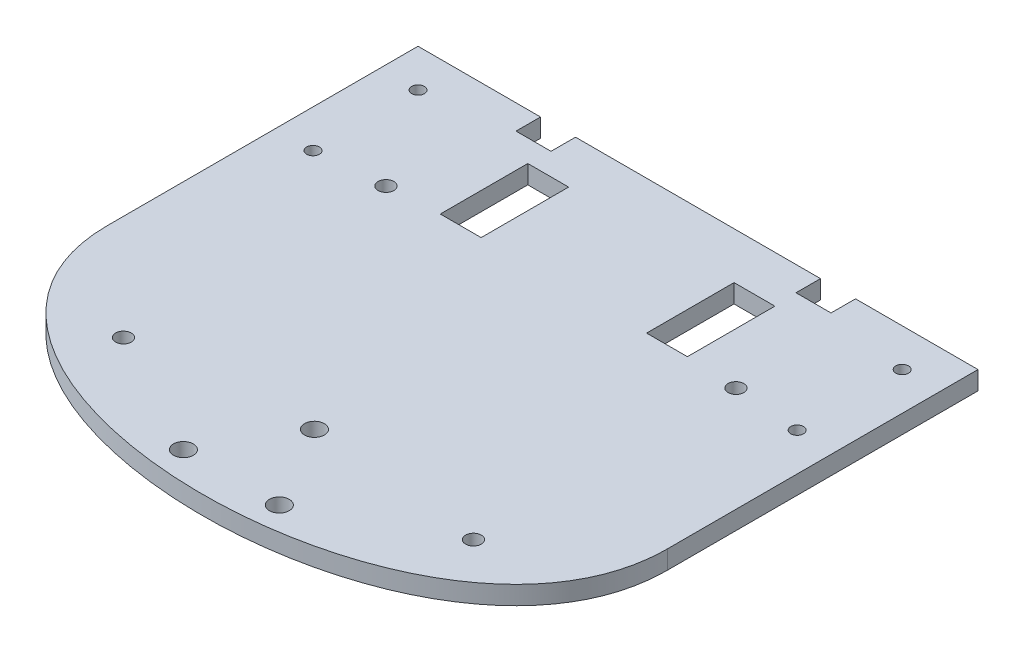
ISO-10303-21;
HEADER;
FILE_DESCRIPTION(('STEP AP214'),'2;1');
FILE_NAME('part.step','',(''),(''),'','','');
FILE_SCHEMA(('AUTOMOTIVE_DESIGN { 1 0 10303 214 1 1 1 1 }'));
ENDSEC;
DATA;
#1=APPLICATION_CONTEXT('core data for automotive mechanical design processes');
#2=APPLICATION_PROTOCOL_DEFINITION('international standard','automotive_design',2000,#1);
#3=PRODUCT_CONTEXT('',#1,'mechanical');
#4=PRODUCT('Part','Part','',(#3));
#5=PRODUCT_RELATED_PRODUCT_CATEGORY('part','',(#4));
#6=PRODUCT_DEFINITION_FORMATION('','',#4);
#7=PRODUCT_DEFINITION_CONTEXT('part definition',#1,'design');
#8=PRODUCT_DEFINITION('design','',#6,#7);
#9=PRODUCT_DEFINITION_SHAPE('','',#8);
#10=(LENGTH_UNIT() NAMED_UNIT(*) SI_UNIT(.MILLI.,.METRE.));
#11=(NAMED_UNIT(*) PLANE_ANGLE_UNIT() SI_UNIT($,.RADIAN.));
#12=(NAMED_UNIT(*) SI_UNIT($,.STERADIAN.) SOLID_ANGLE_UNIT());
#13=UNCERTAINTY_MEASURE_WITH_UNIT(LENGTH_MEASURE(1.E-05),#10,'distance_accuracy_value','');
#14=(GEOMETRIC_REPRESENTATION_CONTEXT(3) GLOBAL_UNCERTAINTY_ASSIGNED_CONTEXT((#13)) GLOBAL_UNIT_ASSIGNED_CONTEXT((#10,
#11,#12)) REPRESENTATION_CONTEXT('',''));
#15=CARTESIAN_POINT('',(0.,0.,0.));
#16=DIRECTION('',(0.,0.,1.));
#17=DIRECTION('',(1.,0.,0.));
#18=AXIS2_PLACEMENT_3D('',#15,#16,#17);
#19=CARTESIAN_POINT('',(48.,3.175,-42.5));
#20=DIRECTION('',(0.,0.,1.));
#21=DIRECTION('',(1.,0.,0.));
#22=AXIS2_PLACEMENT_3D('',#19,#20,#21);
#23=PLANE('',#22);
#24=DIRECTION('',(-1.,0.,0.));
#25=VECTOR('',#24,1.);
#26=CARTESIAN_POINT('',(48.,3.175,-42.5));
#27=LINE('',#26,#25);
#28=CARTESIAN_POINT('',(21.,3.175,-42.5));
#29=VERTEX_POINT('',#28);
#30=CARTESIAN_POINT('',(-21.,3.175,-42.4999999999998));
#31=VERTEX_POINT('',#30);
#32=EDGE_CURVE('E578',#29,#31,#27,.T.);
#33=ORIENTED_EDGE('',*,*,#32,.F.);
#34=DIRECTION('',(0.,1.,0.));
#35=VECTOR('',#34,1.);
#36=CARTESIAN_POINT('',(21.,0.,-42.5));
#37=LINE('',#36,#35);
#38=CARTESIAN_POINT('',(21.,0.,-42.5));
#39=VERTEX_POINT('',#38);
#40=EDGE_CURVE('E215',#39,#29,#37,.T.);
#41=ORIENTED_EDGE('',*,*,#40,.F.);
#42=DIRECTION('',(-1.,0.,0.));
#43=VECTOR('',#42,1.);
#44=CARTESIAN_POINT('',(48.,0.,-42.5));
#45=LINE('',#44,#43);
#46=CARTESIAN_POINT('',(-21.,0.,-42.4999999999998));
#47=VERTEX_POINT('',#46);
#48=EDGE_CURVE('E200',#39,#47,#45,.T.);
#49=ORIENTED_EDGE('',*,*,#48,.T.);
#50=DIRECTION('',(0.,1.,0.));
#51=VECTOR('',#50,1.);
#52=CARTESIAN_POINT('',(-21.,0.,-42.4999999999998));
#53=LINE('',#52,#51);
#54=EDGE_CURVE('E249',#47,#31,#53,.T.);
#55=ORIENTED_EDGE('',*,*,#54,.T.);
#56=EDGE_LOOP('',(#33,#41,#49,#55));
#57=FACE_BOUND('',#56,.T.);
#58=ADVANCED_FACE('F39',(#57),#23,.F.);
#59=CARTESIAN_POINT('',(-27.,3.175,-42.4999999999998));
#60=VERTEX_POINT('',#59);
#61=CARTESIAN_POINT('',(-48.,3.175,-42.5));
#62=VERTEX_POINT('',#61);
#63=EDGE_CURVE('E583',#60,#62,#27,.T.);
#64=ORIENTED_EDGE('',*,*,#63,.F.);
#65=DIRECTION('',(0.,1.,0.));
#66=VECTOR('',#65,1.);
#67=CARTESIAN_POINT('',(-27.,0.,-42.4999999999998));
#68=LINE('',#67,#66);
#69=CARTESIAN_POINT('',(-27.,0.,-42.4999999999998));
#70=VERTEX_POINT('',#69);
#71=EDGE_CURVE('E212',#70,#60,#68,.T.);
#72=ORIENTED_EDGE('',*,*,#71,.F.);
#73=CARTESIAN_POINT('',(-48.,0.,-42.5));
#74=VERTEX_POINT('',#73);
#75=EDGE_CURVE('E603',#70,#74,#45,.T.);
#76=ORIENTED_EDGE('',*,*,#75,.T.);
#77=DIRECTION('',(0.,-1.,0.));
#78=VECTOR('',#77,1.);
#79=CARTESIAN_POINT('',(-48.,3.175,-42.5));
#80=LINE('',#79,#78);
#81=EDGE_CURVE('E587',#62,#74,#80,.T.);
#82=ORIENTED_EDGE('',*,*,#81,.F.);
#83=EDGE_LOOP('',(#64,#72,#76,#82));
#84=FACE_BOUND('',#83,.T.);
#85=ADVANCED_FACE('F469',(#84),#23,.F.);
#86=CARTESIAN_POINT('',(-48.,3.175,-42.5));
#87=DIRECTION('',(1.,0.,0.));
#88=DIRECTION('',(0.,0.,-1.));
#89=AXIS2_PLACEMENT_3D('',#86,#87,#88);
#90=PLANE('',#89);
#91=DIRECTION('',(0.,0.,1.));
#92=VECTOR('',#91,1.);
#93=CARTESIAN_POINT('',(-48.,0.,-42.5));
#94=LINE('',#93,#92);
#95=CARTESIAN_POINT('',(-48.,0.,10.75));
#96=VERTEX_POINT('',#95);
#97=EDGE_CURVE('E439',#74,#96,#94,.T.);
#98=ORIENTED_EDGE('',*,*,#97,.T.);
#99=DIRECTION('',(0.,-1.,0.));
#100=VECTOR('',#99,1.);
#101=CARTESIAN_POINT('',(-48.,3.175,10.75));
#102=LINE('',#101,#100);
#103=CARTESIAN_POINT('',(-48.,3.175,10.75));
#104=VERTEX_POINT('',#103);
#105=EDGE_CURVE('E11',#104,#96,#102,.T.);
#106=ORIENTED_EDGE('',*,*,#105,.F.);
#107=DIRECTION('',(0.,0.,1.));
#108=VECTOR('',#107,1.);
#109=CARTESIAN_POINT('',(-48.,3.175,-42.5));
#110=LINE('',#109,#108);
#111=EDGE_CURVE('E440',#62,#104,#110,.T.);
#112=ORIENTED_EDGE('',*,*,#111,.F.);
#113=ORIENTED_EDGE('',*,*,#81,.T.);
#114=EDGE_LOOP('',(#98,#106,#112,#113));
#115=FACE_BOUND('',#114,.T.);
#116=ADVANCED_FACE('F41',(#115),#90,.F.);
#117=CARTESIAN_POINT('',(-48.,3.175,10.75));
#118=CARTESIAN_POINT('',(-48.,3.175,53.0833333333333));
#119=CARTESIAN_POINT('',(48.0000000000003,3.175,53.0833333333333));
#120=CARTESIAN_POINT('',(48.,3.175,10.75));
#121=B_SPLINE_CURVE_WITH_KNOTS('',3,(#117,#118,#119,#120),.UNSPECIFIED.,.F.,.F.,(4,4),(0.,1.),.UNSPECIFIED.);
#122=DIRECTION('',(0.,-1.,0.));
#123=VECTOR('',#122,1.);
#124=SURFACE_OF_LINEAR_EXTRUSION('',#121,#123);
#125=CARTESIAN_POINT('',(-48.,0.,10.75));
#126=CARTESIAN_POINT('',(-48.,0.,53.0833333333333));
#127=CARTESIAN_POINT('',(48.0000000000003,0.,53.0833333333333));
#128=CARTESIAN_POINT('',(48.,0.,10.75));
#129=B_SPLINE_CURVE_WITH_KNOTS('',3,(#125,#126,#127,#128),.UNSPECIFIED.,.F.,.F.,(4,4),(0.,1.),.UNSPECIFIED.);
#130=CARTESIAN_POINT('',(48.,0.,10.75));
#131=VERTEX_POINT('',#130);
#132=EDGE_CURVE('E592',#96,#131,#129,.T.);
#133=ORIENTED_EDGE('',*,*,#132,.T.);
#134=DIRECTION('',(0.,-1.,0.));
#135=VECTOR('',#134,1.);
#136=CARTESIAN_POINT('',(48.,3.175,10.75));
#137=LINE('',#136,#135);
#138=CARTESIAN_POINT('',(48.,3.175,10.75));
#139=VERTEX_POINT('',#138);
#140=EDGE_CURVE('E48',#139,#131,#137,.T.);
#141=ORIENTED_EDGE('',*,*,#140,.F.);
#142=EDGE_CURVE('E444',#104,#139,#121,.T.);
#143=ORIENTED_EDGE('',*,*,#142,.F.);
#144=ORIENTED_EDGE('',*,*,#105,.T.);
#145=EDGE_LOOP('',(#133,#141,#143,#144));
#146=FACE_BOUND('',#145,.T.);
#147=ADVANCED_FACE('F456',(#146),#124,.F.);
#148=CARTESIAN_POINT('',(48.,3.175,-42.5));
#149=DIRECTION('',(-1.,0.,0.));
#150=DIRECTION('',(0.,0.,1.));
#151=AXIS2_PLACEMENT_3D('',#148,#149,#150);
#152=PLANE('',#151);
#153=DIRECTION('',(0.,0.,-1.));
#154=VECTOR('',#153,1.);
#155=CARTESIAN_POINT('',(48.,0.,-42.5));
#156=LINE('',#155,#154);
#157=CARTESIAN_POINT('',(48.,0.,-42.5));
#158=VERTEX_POINT('',#157);
#159=EDGE_CURVE('E597',#131,#158,#156,.T.);
#160=ORIENTED_EDGE('',*,*,#159,.T.);
#161=DIRECTION('',(0.,-1.,0.));
#162=VECTOR('',#161,1.);
#163=CARTESIAN_POINT('',(48.,3.175,-42.5));
#164=LINE('',#163,#162);
#165=CARTESIAN_POINT('',(48.,3.175,-42.5));
#166=VERTEX_POINT('',#165);
#167=EDGE_CURVE('E610',#166,#158,#164,.T.);
#168=ORIENTED_EDGE('',*,*,#167,.F.);
#169=DIRECTION('',(0.,0.,-1.));
#170=VECTOR('',#169,1.);
#171=CARTESIAN_POINT('',(48.,3.175,-42.5));
#172=LINE('',#171,#170);
#173=EDGE_CURVE('E451',#139,#166,#172,.T.);
#174=ORIENTED_EDGE('',*,*,#173,.F.);
#175=ORIENTED_EDGE('',*,*,#140,.T.);
#176=EDGE_LOOP('',(#160,#168,#174,#175));
#177=FACE_BOUND('',#176,.T.);
#178=ADVANCED_FACE('F459',(#177),#152,.F.);
#179=CARTESIAN_POINT('',(27.,0.,-42.5));
#180=VERTEX_POINT('',#179);
#181=EDGE_CURVE('E445',#158,#180,#45,.T.);
#182=ORIENTED_EDGE('',*,*,#181,.T.);
#183=DIRECTION('',(0.,1.,0.));
#184=VECTOR('',#183,1.);
#185=CARTESIAN_POINT('',(27.,0.,-42.5));
#186=LINE('',#185,#184);
#187=CARTESIAN_POINT('',(27.,3.175,-42.5));
#188=VERTEX_POINT('',#187);
#189=EDGE_CURVE('E219',#180,#188,#186,.T.);
#190=ORIENTED_EDGE('',*,*,#189,.T.);
#191=EDGE_CURVE('E582',#166,#188,#27,.T.);
#192=ORIENTED_EDGE('',*,*,#191,.F.);
#193=ORIENTED_EDGE('',*,*,#167,.T.);
#194=EDGE_LOOP('',(#182,#190,#192,#193));
#195=FACE_BOUND('',#194,.T.);
#196=ADVANCED_FACE('F463',(#195),#23,.F.);
#197=CARTESIAN_POINT('',(1.21430643318376E-13,3.175,42.5));
#198=DIRECTION('',(0.,-1.,0.));
#199=DIRECTION('',(0.,0.,-1.));
#200=AXIS2_PLACEMENT_3D('',#197,#198,#199);
#201=PLANE('',#200);
#202=CARTESIAN_POINT('',(30.,3.175,26.));
#203=DIRECTION('',(0.,-1.,0.));
#204=DIRECTION('',(0.,0.,-1.));
#205=AXIS2_PLACEMENT_3D('',#202,#203,#204);
#206=CIRCLE('',#205,1.35000000000004);
#207=CARTESIAN_POINT('',(30.,3.175,24.65));
#208=VERTEX_POINT('',#207);
#209=EDGE_CURVE('E435',#208,#208,#206,.T.);
#210=ORIENTED_EDGE('',*,*,#209,.T.);
#211=EDGE_LOOP('',(#210));
#212=FACE_BOUND('',#211,.T.);
#213=CARTESIAN_POINT('',(-30.,3.175,26.));
#214=DIRECTION('',(0.,-1.,0.));
#215=DIRECTION('',(0.,0.,-1.));
#216=AXIS2_PLACEMENT_3D('',#213,#214,#215);
#217=CIRCLE('',#216,1.35);
#218=CARTESIAN_POINT('',(-30.,3.175,24.65));
#219=VERTEX_POINT('',#218);
#220=EDGE_CURVE('E431',#219,#219,#217,.T.);
#221=ORIENTED_EDGE('',*,*,#220,.T.);
#222=EDGE_LOOP('',(#221));
#223=FACE_BOUND('',#222,.T.);
#224=CARTESIAN_POINT('',(41.5,3.175,-36.));
#225=DIRECTION('',(0.,-1.,0.));
#226=DIRECTION('',(0.,0.,-1.));
#227=AXIS2_PLACEMENT_3D('',#224,#225,#226);
#228=CIRCLE('',#227,1.09219999999998);
#229=CARTESIAN_POINT('',(41.5,3.175,-37.0922));
#230=VERTEX_POINT('',#229);
#231=EDGE_CURVE('E427',#230,#230,#228,.T.);
#232=ORIENTED_EDGE('',*,*,#231,.T.);
#233=EDGE_LOOP('',(#232));
#234=FACE_BOUND('',#233,.T.);
#235=CARTESIAN_POINT('',(41.5,3.175,-18.));
#236=DIRECTION('',(0.,-1.,0.));
#237=DIRECTION('',(0.,0.,-1.));
#238=AXIS2_PLACEMENT_3D('',#235,#236,#237);
#239=CIRCLE('',#238,1.09219999999998);
#240=CARTESIAN_POINT('',(41.5,3.175,-19.0922));
#241=VERTEX_POINT('',#240);
#242=EDGE_CURVE('E423',#241,#241,#239,.T.);
#243=ORIENTED_EDGE('',*,*,#242,.T.);
#244=EDGE_LOOP('',(#243));
#245=FACE_BOUND('',#244,.T.);
#246=CARTESIAN_POINT('',(0.,3.175,23.253882107746));
#247=DIRECTION('',(0.,-1.,0.));
#248=DIRECTION('',(0.,0.,-1.));
#249=AXIS2_PLACEMENT_3D('',#246,#247,#248);
#250=CIRCLE('',#249,1.7);
#251=CARTESIAN_POINT('',(0.,3.175,21.553882107746));
#252=VERTEX_POINT('',#251);
#253=EDGE_CURVE('E419',#252,#252,#250,.T.);
#254=ORIENTED_EDGE('',*,*,#253,.T.);
#255=EDGE_LOOP('',(#254));
#256=FACE_BOUND('',#255,.T.);
#257=CARTESIAN_POINT('',(-41.5,3.175,-36.));
#258=DIRECTION('',(0.,-1.,0.));
#259=DIRECTION('',(0.,0.,-1.));
#260=AXIS2_PLACEMENT_3D('',#257,#258,#259);
#261=CIRCLE('',#260,1.0922);
#262=CARTESIAN_POINT('',(-41.5,3.175,-37.0922));
#263=VERTEX_POINT('',#262);
#264=EDGE_CURVE('E415',#263,#263,#261,.T.);
#265=ORIENTED_EDGE('',*,*,#264,.T.);
#266=EDGE_LOOP('',(#265));
#267=FACE_BOUND('',#266,.T.);
#268=CARTESIAN_POINT('',(-30.,3.175,-19.));
#269=DIRECTION('',(0.,-1.,0.));
#270=DIRECTION('',(0.,0.,-1.));
#271=AXIS2_PLACEMENT_3D('',#268,#269,#270);
#272=CIRCLE('',#271,1.35);
#273=CARTESIAN_POINT('',(-30.,3.175,-20.35));
#274=VERTEX_POINT('',#273);
#275=EDGE_CURVE('E411',#274,#274,#272,.T.);
#276=ORIENTED_EDGE('',*,*,#275,.T.);
#277=EDGE_LOOP('',(#276));
#278=FACE_BOUND('',#277,.T.);
#279=CARTESIAN_POINT('',(-41.5,3.175,-18.));
#280=DIRECTION('',(0.,-1.,0.));
#281=DIRECTION('',(0.,0.,-1.));
#282=AXIS2_PLACEMENT_3D('',#279,#280,#281);
#283=CIRCLE('',#282,1.0922);
#284=CARTESIAN_POINT('',(-41.5,3.175,-19.0922));
#285=VERTEX_POINT('',#284);
#286=EDGE_CURVE('E407',#285,#285,#283,.T.);
#287=ORIENTED_EDGE('',*,*,#286,.T.);
#288=EDGE_LOOP('',(#287));
#289=FACE_BOUND('',#288,.T.);
#290=CARTESIAN_POINT('',(8.225,3.175,37.5));
#291=DIRECTION('',(0.,-1.,0.));
#292=DIRECTION('',(0.,0.,-1.));
#293=AXIS2_PLACEMENT_3D('',#290,#291,#292);
#294=CIRCLE('',#293,1.7);
#295=CARTESIAN_POINT('',(8.225,3.175,35.8));
#296=VERTEX_POINT('',#295);
#297=EDGE_CURVE('E403',#296,#296,#294,.T.);
#298=ORIENTED_EDGE('',*,*,#297,.T.);
#299=EDGE_LOOP('',(#298));
#300=FACE_BOUND('',#299,.T.);
#301=DIRECTION('',(-1.,0.,0.));
#302=VECTOR('',#301,1.);
#303=CARTESIAN_POINT('',(1.52160030607109E-13,3.175,-19.5));
#304=LINE('',#303,#302);
#305=CARTESIAN_POINT('',(-14.18,3.175,-19.5));
#306=VERTEX_POINT('',#305);
#307=CARTESIAN_POINT('',(-21.18,3.175,-19.5));
#308=VERTEX_POINT('',#307);
#309=EDGE_CURVE('E387',#306,#308,#304,.T.);
#310=ORIENTED_EDGE('',*,*,#309,.T.);
#311=DIRECTION('',(0.,0.,-1.));
#312=VECTOR('',#311,1.);
#313=CARTESIAN_POINT('',(-21.18,3.175,42.5));
#314=LINE('',#313,#312);
#315=CARTESIAN_POINT('',(-21.18,3.175,-34.5));
#316=VERTEX_POINT('',#315);
#317=EDGE_CURVE('E399',#308,#316,#314,.T.);
#318=ORIENTED_EDGE('',*,*,#317,.T.);
#319=DIRECTION('',(1.,0.,0.));
#320=VECTOR('',#319,1.);
#321=CARTESIAN_POINT('',(1.21430643318376E-13,3.175,-34.5));
#322=LINE('',#321,#320);
#323=CARTESIAN_POINT('',(-14.18,3.175,-34.5));
#324=VERTEX_POINT('',#323);
#325=EDGE_CURVE('E395',#316,#324,#322,.T.);
#326=ORIENTED_EDGE('',*,*,#325,.T.);
#327=DIRECTION('',(0.,0.,1.));
#328=VECTOR('',#327,1.);
#329=CARTESIAN_POINT('',(-14.18,3.175,42.5));
#330=LINE('',#329,#328);
#331=EDGE_CURVE('E391',#324,#306,#330,.T.);
#332=ORIENTED_EDGE('',*,*,#331,.T.);
#333=EDGE_LOOP('',(#310,#318,#326,#332));
#334=FACE_BOUND('',#333,.T.);
#335=CARTESIAN_POINT('',(-8.225,3.175,37.5));
#336=DIRECTION('',(0.,-1.,0.));
#337=DIRECTION('',(0.,0.,-1.));
#338=AXIS2_PLACEMENT_3D('',#335,#336,#337);
#339=CIRCLE('',#338,1.7);
#340=CARTESIAN_POINT('',(-8.225,3.175,35.8));
#341=VERTEX_POINT('',#340);
#342=EDGE_CURVE('E383',#341,#341,#339,.T.);
#343=ORIENTED_EDGE('',*,*,#342,.T.);
#344=EDGE_LOOP('',(#343));
#345=FACE_BOUND('',#344,.T.);
#346=CARTESIAN_POINT('',(30.,3.175,-19.));
#347=DIRECTION('',(0.,-1.,0.));
#348=DIRECTION('',(0.,0.,-1.));
#349=AXIS2_PLACEMENT_3D('',#346,#347,#348);
#350=CIRCLE('',#349,1.35);
#351=CARTESIAN_POINT('',(30.,3.175,-20.35));
#352=VERTEX_POINT('',#351);
#353=EDGE_CURVE('E379',#352,#352,#350,.T.);
#354=ORIENTED_EDGE('',*,*,#353,.T.);
#355=EDGE_LOOP('',(#354));
#356=FACE_BOUND('',#355,.T.);
#357=DIRECTION('',(-1.,0.,0.));
#358=VECTOR('',#357,1.);
#359=CARTESIAN_POINT('',(1.21430643318376E-13,3.175,-19.5));
#360=LINE('',#359,#358);
#361=CARTESIAN_POINT('',(21.18,3.175,-19.5));
#362=VERTEX_POINT('',#361);
#363=CARTESIAN_POINT('',(14.18,3.175,-19.5));
#364=VERTEX_POINT('',#363);
#365=EDGE_CURVE('E353',#362,#364,#360,.T.);
#366=ORIENTED_EDGE('',*,*,#365,.T.);
#367=DIRECTION('',(0.,0.,-1.));
#368=VECTOR('',#367,1.);
#369=CARTESIAN_POINT('',(14.18,3.175,42.5));
#370=LINE('',#369,#368);
#371=CARTESIAN_POINT('',(14.18,3.175,-34.5));
#372=VERTEX_POINT('',#371);
#373=EDGE_CURVE('E375',#364,#372,#370,.T.);
#374=ORIENTED_EDGE('',*,*,#373,.T.);
#375=DIRECTION('',(1.,0.,0.));
#376=VECTOR('',#375,1.);
#377=CARTESIAN_POINT('',(1.21430643318376E-13,3.175,-34.5));
#378=LINE('',#377,#376);
#379=CARTESIAN_POINT('',(21.18,3.175,-34.5));
#380=VERTEX_POINT('',#379);
#381=EDGE_CURVE('E371',#372,#380,#378,.T.);
#382=ORIENTED_EDGE('',*,*,#381,.T.);
#383=DIRECTION('',(0.,0.,1.));
#384=VECTOR('',#383,1.);
#385=CARTESIAN_POINT('',(21.18,3.175,42.5));
#386=LINE('',#385,#384);
#387=EDGE_CURVE('E367',#380,#362,#386,.T.);
#388=ORIENTED_EDGE('',*,*,#387,.T.);
#389=EDGE_LOOP('',(#366,#374,#382,#388));
#390=FACE_BOUND('',#389,.T.);
#391=DIRECTION('',(1.,0.,0.));
#392=VECTOR('',#391,1.);
#393=CARTESIAN_POINT('',(21.,3.175,-38.3));
#394=LINE('',#393,#392);
#395=CARTESIAN_POINT('',(21.,3.175,-38.3));
#396=VERTEX_POINT('',#395);
#397=CARTESIAN_POINT('',(27.,3.175,-38.3));
#398=VERTEX_POINT('',#397);
#399=EDGE_CURVE('E205',#396,#398,#394,.T.);
#400=ORIENTED_EDGE('',*,*,#399,.F.);
#401=DIRECTION('',(0.,0.,1.));
#402=VECTOR('',#401,1.);
#403=CARTESIAN_POINT('',(21.,3.175,-42.5));
#404=LINE('',#403,#402);
#405=EDGE_CURVE('E183',#29,#396,#404,.T.);
#406=ORIENTED_EDGE('',*,*,#405,.F.);
#407=ORIENTED_EDGE('',*,*,#32,.T.);
#408=DIRECTION('',(0.,0.,-1.));
#409=VECTOR('',#408,1.);
#410=CARTESIAN_POINT('',(-21.,3.175,-42.4999999999998));
#411=LINE('',#410,#409);
#412=CARTESIAN_POINT('',(-21.,3.175,-38.2999999999998));
#413=VERTEX_POINT('',#412);
#414=EDGE_CURVE('E230',#413,#31,#411,.T.);
#415=ORIENTED_EDGE('',*,*,#414,.F.);
#416=DIRECTION('',(1.,0.,0.));
#417=VECTOR('',#416,1.);
#418=CARTESIAN_POINT('',(-27.,3.175,-38.2999999999998));
#419=LINE('',#418,#417);
#420=CARTESIAN_POINT('',(-27.,3.175,-38.2999999999998));
#421=VERTEX_POINT('',#420);
#422=EDGE_CURVE('E241',#421,#413,#419,.T.);
#423=ORIENTED_EDGE('',*,*,#422,.F.);
#424=DIRECTION('',(0.,0.,1.));
#425=VECTOR('',#424,1.);
#426=CARTESIAN_POINT('',(-27.,3.175,-42.4999999999998));
#427=LINE('',#426,#425);
#428=EDGE_CURVE('E237',#60,#421,#427,.T.);
#429=ORIENTED_EDGE('',*,*,#428,.F.);
#430=ORIENTED_EDGE('',*,*,#63,.T.);
#431=ORIENTED_EDGE('',*,*,#111,.T.);
#432=ORIENTED_EDGE('',*,*,#142,.T.);
#433=ORIENTED_EDGE('',*,*,#173,.T.);
#434=ORIENTED_EDGE('',*,*,#191,.T.);
#435=DIRECTION('',(0.,0.,-1.));
#436=VECTOR('',#435,1.);
#437=CARTESIAN_POINT('',(27.,3.175,-42.5));
#438=LINE('',#437,#436);
#439=EDGE_CURVE('E202',#398,#188,#438,.T.);
#440=ORIENTED_EDGE('',*,*,#439,.F.);
#441=EDGE_LOOP('',(#400,#406,#407,#415,#423,#429,#430,#431,#432,#433,#434,#440));
#442=FACE_BOUND('',#441,.T.);
#443=ADVANCED_FACE('F467',(#212,#223,#234,#245,#256,#267,#278,#289,#300,#334,#345,#356,#390,
#442),#201,.F.);
#444=CARTESIAN_POINT('',(1.21430643318376E-13,0.,42.5));
#445=DIRECTION('',(0.,-1.,0.));
#446=DIRECTION('',(0.,0.,-1.));
#447=AXIS2_PLACEMENT_3D('',#444,#445,#446);
#448=PLANE('',#447);
#449=DIRECTION('',(0.,0.,1.));
#450=VECTOR('',#449,1.);
#451=CARTESIAN_POINT('',(21.,0.,-42.5));
#452=LINE('',#451,#450);
#453=CARTESIAN_POINT('',(21.,0.,-38.3));
#454=VERTEX_POINT('',#453);
#455=EDGE_CURVE('E180',#39,#454,#452,.T.);
#456=ORIENTED_EDGE('',*,*,#455,.T.);
#457=DIRECTION('',(1.,0.,0.));
#458=VECTOR('',#457,1.);
#459=CARTESIAN_POINT('',(21.,0.,-38.3));
#460=LINE('',#459,#458);
#461=CARTESIAN_POINT('',(27.,0.,-38.3));
#462=VERTEX_POINT('',#461);
#463=EDGE_CURVE('E191',#454,#462,#460,.T.);
#464=ORIENTED_EDGE('',*,*,#463,.T.);
#465=DIRECTION('',(0.,0.,-1.));
#466=VECTOR('',#465,1.);
#467=CARTESIAN_POINT('',(27.,0.,-42.5));
#468=LINE('',#467,#466);
#469=EDGE_CURVE('E55',#462,#180,#468,.T.);
#470=ORIENTED_EDGE('',*,*,#469,.T.);
#471=ORIENTED_EDGE('',*,*,#181,.F.);
#472=ORIENTED_EDGE('',*,*,#159,.F.);
#473=ORIENTED_EDGE('',*,*,#132,.F.);
#474=ORIENTED_EDGE('',*,*,#97,.F.);
#475=ORIENTED_EDGE('',*,*,#75,.F.);
#476=DIRECTION('',(0.,0.,1.));
#477=VECTOR('',#476,1.);
#478=CARTESIAN_POINT('',(-27.,0.,-42.4999999999998));
#479=LINE('',#478,#477);
#480=CARTESIAN_POINT('',(-27.,0.,-38.2999999999998));
#481=VERTEX_POINT('',#480);
#482=EDGE_CURVE('E225',#70,#481,#479,.T.);
#483=ORIENTED_EDGE('',*,*,#482,.T.);
#484=DIRECTION('',(1.,0.,0.));
#485=VECTOR('',#484,1.);
#486=CARTESIAN_POINT('',(-27.,0.,-38.2999999999998));
#487=LINE('',#486,#485);
#488=CARTESIAN_POINT('',(-21.,0.,-38.2999999999998));
#489=VERTEX_POINT('',#488);
#490=EDGE_CURVE('E229',#481,#489,#487,.T.);
#491=ORIENTED_EDGE('',*,*,#490,.T.);
#492=DIRECTION('',(0.,0.,-1.));
#493=VECTOR('',#492,1.);
#494=CARTESIAN_POINT('',(-21.,0.,-42.4999999999998));
#495=LINE('',#494,#493);
#496=EDGE_CURVE('E63',#489,#47,#495,.T.);
#497=ORIENTED_EDGE('',*,*,#496,.T.);
#498=ORIENTED_EDGE('',*,*,#48,.F.);
#499=EDGE_LOOP('',(#456,#464,#470,#471,#472,#473,#474,#475,#483,#491,#497,#498));
#500=FACE_BOUND('',#499,.T.);
#501=CARTESIAN_POINT('',(30.,0.,26.));
#502=DIRECTION('',(0.,1.,0.));
#503=DIRECTION('',(0.,0.,-1.));
#504=AXIS2_PLACEMENT_3D('',#501,#502,#503);
#505=CIRCLE('',#504,1.35000000000004);
#506=CARTESIAN_POINT('',(30.,0.,24.65));
#507=VERTEX_POINT('',#506);
#508=EDGE_CURVE('E297',#507,#507,#505,.T.);
#509=ORIENTED_EDGE('',*,*,#508,.T.);
#510=EDGE_LOOP('',(#509));
#511=FACE_BOUND('',#510,.T.);
#512=CARTESIAN_POINT('',(-30.,0.,26.));
#513=DIRECTION('',(0.,1.,0.));
#514=DIRECTION('',(0.,0.,1.));
#515=AXIS2_PLACEMENT_3D('',#512,#513,#514);
#516=CIRCLE('',#515,1.35);
#517=CARTESIAN_POINT('',(-30.,0.,27.35));
#518=VERTEX_POINT('',#517);
#519=EDGE_CURVE('E310',#518,#518,#516,.T.);
#520=ORIENTED_EDGE('',*,*,#519,.T.);
#521=EDGE_LOOP('',(#520));
#522=FACE_BOUND('',#521,.T.);
#523=CARTESIAN_POINT('',(41.5,0.,-36.));
#524=DIRECTION('',(0.,1.,0.));
#525=DIRECTION('',(0.,0.,-1.));
#526=AXIS2_PLACEMENT_3D('',#523,#524,#525);
#527=CIRCLE('',#526,1.09219999999998);
#528=CARTESIAN_POINT('',(41.5,0.,-37.0922));
#529=VERTEX_POINT('',#528);
#530=EDGE_CURVE('E306',#529,#529,#527,.T.);
#531=ORIENTED_EDGE('',*,*,#530,.T.);
#532=EDGE_LOOP('',(#531));
#533=FACE_BOUND('',#532,.T.);
#534=CARTESIAN_POINT('',(41.5,0.,-18.));
#535=DIRECTION('',(0.,1.,0.));
#536=DIRECTION('',(0.,0.,-1.));
#537=AXIS2_PLACEMENT_3D('',#534,#535,#536);
#538=CIRCLE('',#537,1.09219999999998);
#539=CARTESIAN_POINT('',(41.5,0.,-19.0922));
#540=VERTEX_POINT('',#539);
#541=EDGE_CURVE('E301',#540,#540,#538,.T.);
#542=ORIENTED_EDGE('',*,*,#541,.T.);
#543=EDGE_LOOP('',(#542));
#544=FACE_BOUND('',#543,.T.);
#545=CARTESIAN_POINT('',(0.,0.,23.253882107746));
#546=DIRECTION('',(0.,1.,0.));
#547=DIRECTION('',(0.,0.,-1.));
#548=AXIS2_PLACEMENT_3D('',#545,#546,#547);
#549=CIRCLE('',#548,1.7);
#550=CARTESIAN_POINT('',(0.,0.,21.553882107746));
#551=VERTEX_POINT('',#550);
#552=EDGE_CURVE('E325',#551,#551,#549,.T.);
#553=ORIENTED_EDGE('',*,*,#552,.T.);
#554=EDGE_LOOP('',(#553));
#555=FACE_BOUND('',#554,.T.);
#556=CARTESIAN_POINT('',(-41.5,0.,-36.));
#557=DIRECTION('',(0.,1.,0.));
#558=DIRECTION('',(0.,0.,1.));
#559=AXIS2_PLACEMENT_3D('',#556,#557,#558);
#560=CIRCLE('',#559,1.0922);
#561=CARTESIAN_POINT('',(-41.5,0.,-34.9078));
#562=VERTEX_POINT('',#561);
#563=EDGE_CURVE('E321',#562,#562,#560,.T.);
#564=ORIENTED_EDGE('',*,*,#563,.T.);
#565=EDGE_LOOP('',(#564));
#566=FACE_BOUND('',#565,.T.);
#567=CARTESIAN_POINT('',(-30.,0.,-19.));
#568=DIRECTION('',(0.,1.,0.));
#569=DIRECTION('',(0.,0.,1.));
#570=AXIS2_PLACEMENT_3D('',#567,#568,#569);
#571=CIRCLE('',#570,1.35);
#572=CARTESIAN_POINT('',(-30.,0.,-17.65));
#573=VERTEX_POINT('',#572);
#574=EDGE_CURVE('E317',#573,#573,#571,.T.);
#575=ORIENTED_EDGE('',*,*,#574,.T.);
#576=EDGE_LOOP('',(#575));
#577=FACE_BOUND('',#576,.T.);
#578=CARTESIAN_POINT('',(-41.5,0.,-18.));
#579=DIRECTION('',(0.,1.,0.));
#580=DIRECTION('',(0.,0.,1.));
#581=AXIS2_PLACEMENT_3D('',#578,#579,#580);
#582=CIRCLE('',#581,1.0922);
#583=CARTESIAN_POINT('',(-41.5,0.,-16.9078));
#584=VERTEX_POINT('',#583);
#585=EDGE_CURVE('E305',#584,#584,#582,.T.);
#586=ORIENTED_EDGE('',*,*,#585,.T.);
#587=EDGE_LOOP('',(#586));
#588=FACE_BOUND('',#587,.T.);
#589=CARTESIAN_POINT('',(8.225,0.,37.5));
#590=DIRECTION('',(0.,1.,0.));
#591=DIRECTION('',(0.,0.,-1.));
#592=AXIS2_PLACEMENT_3D('',#589,#590,#591);
#593=CIRCLE('',#592,1.7);
#594=CARTESIAN_POINT('',(8.225,0.,35.8));
#595=VERTEX_POINT('',#594);
#596=EDGE_CURVE('E218',#595,#595,#593,.T.);
#597=ORIENTED_EDGE('',*,*,#596,.T.);
#598=EDGE_LOOP('',(#597));
#599=FACE_BOUND('',#598,.T.);
#600=DIRECTION('',(0.,0.,1.));
#601=VECTOR('',#600,1.);
#602=CARTESIAN_POINT('',(-21.18,0.,-34.5));
#603=LINE('',#602,#601);
#604=CARTESIAN_POINT('',(-21.18,0.,-34.5));
#605=VERTEX_POINT('',#604);
#606=CARTESIAN_POINT('',(-21.18,0.,-19.5));
#607=VERTEX_POINT('',#606);
#608=EDGE_CURVE('E258',#605,#607,#603,.T.);
#609=ORIENTED_EDGE('',*,*,#608,.T.);
#610=DIRECTION('',(1.,0.,0.));
#611=VECTOR('',#610,1.);
#612=CARTESIAN_POINT('',(-21.18,0.,-19.5));
#613=LINE('',#612,#611);
#614=CARTESIAN_POINT('',(-14.18,0.,-19.5));
#615=VERTEX_POINT('',#614);
#616=EDGE_CURVE('E262',#607,#615,#613,.T.);
#617=ORIENTED_EDGE('',*,*,#616,.T.);
#618=DIRECTION('',(0.,0.,-1.));
#619=VECTOR('',#618,1.);
#620=CARTESIAN_POINT('',(-14.18,0.,-34.5));
#621=LINE('',#620,#619);
#622=CARTESIAN_POINT('',(-14.18,0.,-34.5));
#623=VERTEX_POINT('',#622);
#624=EDGE_CURVE('E266',#615,#623,#621,.T.);
#625=ORIENTED_EDGE('',*,*,#624,.T.);
#626=DIRECTION('',(-1.,0.,0.));
#627=VECTOR('',#626,1.);
#628=CARTESIAN_POINT('',(-21.18,0.,-34.5));
#629=LINE('',#628,#627);
#630=EDGE_CURVE('E270',#623,#605,#629,.T.);
#631=ORIENTED_EDGE('',*,*,#630,.T.);
#632=EDGE_LOOP('',(#609,#617,#625,#631));
#633=FACE_BOUND('',#632,.T.);
#634=CARTESIAN_POINT('',(-8.225,0.,37.5));
#635=DIRECTION('',(0.,1.,0.));
#636=DIRECTION('',(0.,0.,1.));
#637=AXIS2_PLACEMENT_3D('',#634,#635,#636);
#638=CIRCLE('',#637,1.7);
#639=CARTESIAN_POINT('',(-8.225,0.,39.2));
#640=VERTEX_POINT('',#639);
#641=EDGE_CURVE('E279',#640,#640,#638,.T.);
#642=ORIENTED_EDGE('',*,*,#641,.T.);
#643=EDGE_LOOP('',(#642));
#644=FACE_BOUND('',#643,.T.);
#645=CARTESIAN_POINT('',(30.,0.,-19.));
#646=DIRECTION('',(0.,1.,0.));
#647=DIRECTION('',(0.,0.,-1.));
#648=AXIS2_PLACEMENT_3D('',#645,#646,#647);
#649=CIRCLE('',#648,1.35);
#650=CARTESIAN_POINT('',(30.,0.,-20.35));
#651=VERTEX_POINT('',#650);
#652=EDGE_CURVE('E293',#651,#651,#649,.T.);
#653=ORIENTED_EDGE('',*,*,#652,.T.);
#654=EDGE_LOOP('',(#653));
#655=FACE_BOUND('',#654,.T.);
#656=DIRECTION('',(0.,0.,1.));
#657=VECTOR('',#656,1.);
#658=CARTESIAN_POINT('',(14.18,0.,-34.5));
#659=LINE('',#658,#657);
#660=CARTESIAN_POINT('',(14.18,0.,-34.5));
#661=VERTEX_POINT('',#660);
#662=CARTESIAN_POINT('',(14.18,0.,-19.5));
#663=VERTEX_POINT('',#662);
#664=EDGE_CURVE('E329',#661,#663,#659,.T.);
#665=ORIENTED_EDGE('',*,*,#664,.T.);
#666=DIRECTION('',(1.,0.,0.));
#667=VECTOR('',#666,1.);
#668=CARTESIAN_POINT('',(14.18,0.,-19.5));
#669=LINE('',#668,#667);
#670=CARTESIAN_POINT('',(21.18,0.,-19.5));
#671=VERTEX_POINT('',#670);
#672=EDGE_CURVE('E336',#663,#671,#669,.T.);
#673=ORIENTED_EDGE('',*,*,#672,.T.);
#674=DIRECTION('',(0.,0.,-1.));
#675=VECTOR('',#674,1.);
#676=CARTESIAN_POINT('',(21.18,0.,-34.5));
#677=LINE('',#676,#675);
#678=CARTESIAN_POINT('',(21.18,0.,-34.5));
#679=VERTEX_POINT('',#678);
#680=EDGE_CURVE('E340',#671,#679,#677,.T.);
#681=ORIENTED_EDGE('',*,*,#680,.T.);
#682=DIRECTION('',(-1.,0.,0.));
#683=VECTOR('',#682,1.);
#684=CARTESIAN_POINT('',(14.18,0.,-34.5));
#685=LINE('',#684,#683);
#686=EDGE_CURVE('E344',#679,#661,#685,.T.);
#687=ORIENTED_EDGE('',*,*,#686,.T.);
#688=EDGE_LOOP('',(#665,#673,#681,#687));
#689=FACE_BOUND('',#688,.T.);
#690=ADVANCED_FACE('F197',(#500,#511,#522,#533,#544,#555,#566,#577,#588,#599,#633,#644,#655,
#689),#448,.T.);
#691=CARTESIAN_POINT('',(14.18,0.,-34.5));
#692=DIRECTION('',(-1.,0.,0.));
#693=DIRECTION('',(0.,0.,1.));
#694=AXIS2_PLACEMENT_3D('',#691,#692,#693);
#695=PLANE('',#694);
#696=DIRECTION('',(0.,1.,0.));
#697=VECTOR('',#696,1.);
#698=CARTESIAN_POINT('',(14.18,0.,-19.5));
#699=LINE('',#698,#697);
#700=EDGE_CURVE('E348',#663,#364,#699,.T.);
#701=ORIENTED_EDGE('',*,*,#700,.F.);
#702=ORIENTED_EDGE('',*,*,#664,.F.);
#703=DIRECTION('',(0.,1.,0.));
#704=VECTOR('',#703,1.);
#705=CARTESIAN_POINT('',(14.18,0.,-34.5));
#706=LINE('',#705,#704);
#707=EDGE_CURVE('E349',#661,#372,#706,.T.);
#708=ORIENTED_EDGE('',*,*,#707,.T.);
#709=ORIENTED_EDGE('',*,*,#373,.F.);
#710=EDGE_LOOP('',(#701,#702,#708,#709));
#711=FACE_BOUND('',#710,.T.);
#712=ADVANCED_FACE('F472',(#711),#695,.F.);
#713=CARTESIAN_POINT('',(14.18,0.,-34.5));
#714=DIRECTION('',(0.,0.,-1.));
#715=DIRECTION('',(-1.,0.,0.));
#716=AXIS2_PLACEMENT_3D('',#713,#714,#715);
#717=PLANE('',#716);
#718=ORIENTED_EDGE('',*,*,#707,.F.);
#719=ORIENTED_EDGE('',*,*,#686,.F.);
#720=DIRECTION('',(0.,1.,0.));
#721=VECTOR('',#720,1.);
#722=CARTESIAN_POINT('',(21.18,0.,-34.5));
#723=LINE('',#722,#721);
#724=EDGE_CURVE('E354',#679,#380,#723,.T.);
#725=ORIENTED_EDGE('',*,*,#724,.T.);
#726=ORIENTED_EDGE('',*,*,#381,.F.);
#727=EDGE_LOOP('',(#718,#719,#725,#726));
#728=FACE_BOUND('',#727,.T.);
#729=ADVANCED_FACE('F478',(#728),#717,.F.);
#730=CARTESIAN_POINT('',(21.18,0.,-34.5));
#731=DIRECTION('',(1.,0.,0.));
#732=DIRECTION('',(0.,0.,-1.));
#733=AXIS2_PLACEMENT_3D('',#730,#731,#732);
#734=PLANE('',#733);
#735=ORIENTED_EDGE('',*,*,#724,.F.);
#736=ORIENTED_EDGE('',*,*,#680,.F.);
#737=DIRECTION('',(0.,1.,0.));
#738=VECTOR('',#737,1.);
#739=CARTESIAN_POINT('',(21.18,0.,-19.5));
#740=LINE('',#739,#738);
#741=EDGE_CURVE('E358',#671,#362,#740,.T.);
#742=ORIENTED_EDGE('',*,*,#741,.T.);
#743=ORIENTED_EDGE('',*,*,#387,.F.);
#744=EDGE_LOOP('',(#735,#736,#742,#743));
#745=FACE_BOUND('',#744,.T.);
#746=ADVANCED_FACE('F484',(#745),#734,.F.);
#747=CARTESIAN_POINT('',(14.18,0.,-19.5));
#748=DIRECTION('',(0.,0.,1.));
#749=DIRECTION('',(1.,0.,0.));
#750=AXIS2_PLACEMENT_3D('',#747,#748,#749);
#751=PLANE('',#750);
#752=ORIENTED_EDGE('',*,*,#741,.F.);
#753=ORIENTED_EDGE('',*,*,#672,.F.);
#754=ORIENTED_EDGE('',*,*,#700,.T.);
#755=ORIENTED_EDGE('',*,*,#365,.F.);
#756=EDGE_LOOP('',(#752,#753,#754,#755));
#757=FACE_BOUND('',#756,.T.);
#758=ADVANCED_FACE('F480',(#757),#751,.F.);
#759=CARTESIAN_POINT('',(30.,0.,-19.));
#760=DIRECTION('',(0.,1.,0.));
#761=DIRECTION('',(0.,0.,1.));
#762=AXIS2_PLACEMENT_3D('',#759,#760,#761);
#763=CYLINDRICAL_SURFACE('',#762,1.35);
#764=ORIENTED_EDGE('',*,*,#652,.F.);
#765=EDGE_LOOP('',(#764));
#766=FACE_BOUND('',#765,.T.);
#767=ORIENTED_EDGE('',*,*,#353,.F.);
#768=EDGE_LOOP('',(#767));
#769=FACE_BOUND('',#768,.T.);
#770=ADVANCED_FACE('F483',(#766,#769),#763,.F.);
#771=CARTESIAN_POINT('',(-8.225,0.,37.5));
#772=DIRECTION('',(0.,1.,0.));
#773=DIRECTION('',(0.,0.,1.));
#774=AXIS2_PLACEMENT_3D('',#771,#772,#773);
#775=CYLINDRICAL_SURFACE('',#774,1.7);
#776=ORIENTED_EDGE('',*,*,#641,.F.);
#777=EDGE_LOOP('',(#776));
#778=FACE_BOUND('',#777,.T.);
#779=ORIENTED_EDGE('',*,*,#342,.F.);
#780=EDGE_LOOP('',(#779));
#781=FACE_BOUND('',#780,.T.);
#782=ADVANCED_FACE('F526',(#778,#781),#775,.F.);
#783=CARTESIAN_POINT('',(-21.18,0.,-34.5));
#784=DIRECTION('',(-1.,0.,0.));
#785=DIRECTION('',(0.,0.,1.));
#786=AXIS2_PLACEMENT_3D('',#783,#784,#785);
#787=PLANE('',#786);
#788=DIRECTION('',(0.,1.,0.));
#789=VECTOR('',#788,1.);
#790=CARTESIAN_POINT('',(-21.18,0.,-19.5));
#791=LINE('',#790,#789);
#792=EDGE_CURVE('E274',#607,#308,#791,.T.);
#793=ORIENTED_EDGE('',*,*,#792,.F.);
#794=ORIENTED_EDGE('',*,*,#608,.F.);
#795=DIRECTION('',(0.,1.,0.));
#796=VECTOR('',#795,1.);
#797=CARTESIAN_POINT('',(-21.18,0.,-34.5));
#798=LINE('',#797,#796);
#799=EDGE_CURVE('E275',#605,#316,#798,.T.);
#800=ORIENTED_EDGE('',*,*,#799,.T.);
#801=ORIENTED_EDGE('',*,*,#317,.F.);
#802=EDGE_LOOP('',(#793,#794,#800,#801));
#803=FACE_BOUND('',#802,.T.);
#804=ADVANCED_FACE('F529',(#803),#787,.F.);
#805=CARTESIAN_POINT('',(-21.18,0.,-34.5));
#806=DIRECTION('',(0.,0.,-1.));
#807=DIRECTION('',(-1.,0.,0.));
#808=AXIS2_PLACEMENT_3D('',#805,#806,#807);
#809=PLANE('',#808);
#810=ORIENTED_EDGE('',*,*,#799,.F.);
#811=ORIENTED_EDGE('',*,*,#630,.F.);
#812=DIRECTION('',(0.,1.,0.));
#813=VECTOR('',#812,1.);
#814=CARTESIAN_POINT('',(-14.18,0.,-34.5));
#815=LINE('',#814,#813);
#816=EDGE_CURVE('E280',#623,#324,#815,.T.);
#817=ORIENTED_EDGE('',*,*,#816,.T.);
#818=ORIENTED_EDGE('',*,*,#325,.F.);
#819=EDGE_LOOP('',(#810,#811,#817,#818));
#820=FACE_BOUND('',#819,.T.);
#821=ADVANCED_FACE('F540',(#820),#809,.F.);
#822=CARTESIAN_POINT('',(-14.18,0.,-34.5));
#823=DIRECTION('',(1.,0.,0.));
#824=DIRECTION('',(0.,0.,-1.));
#825=AXIS2_PLACEMENT_3D('',#822,#823,#824);
#826=PLANE('',#825);
#827=ORIENTED_EDGE('',*,*,#816,.F.);
#828=ORIENTED_EDGE('',*,*,#624,.F.);
#829=DIRECTION('',(0.,1.,0.));
#830=VECTOR('',#829,1.);
#831=CARTESIAN_POINT('',(-14.18,0.,-19.5));
#832=LINE('',#831,#830);
#833=EDGE_CURVE('E284',#615,#306,#832,.T.);
#834=ORIENTED_EDGE('',*,*,#833,.T.);
#835=ORIENTED_EDGE('',*,*,#331,.F.);
#836=EDGE_LOOP('',(#827,#828,#834,#835));
#837=FACE_BOUND('',#836,.T.);
#838=ADVANCED_FACE('F544',(#837),#826,.F.);
#839=CARTESIAN_POINT('',(-21.18,0.,-19.5));
#840=DIRECTION('',(0.,0.,1.));
#841=DIRECTION('',(1.,0.,0.));
#842=AXIS2_PLACEMENT_3D('',#839,#840,#841);
#843=PLANE('',#842);
#844=ORIENTED_EDGE('',*,*,#833,.F.);
#845=ORIENTED_EDGE('',*,*,#616,.F.);
#846=ORIENTED_EDGE('',*,*,#792,.T.);
#847=ORIENTED_EDGE('',*,*,#309,.F.);
#848=EDGE_LOOP('',(#844,#845,#846,#847));
#849=FACE_BOUND('',#848,.T.);
#850=ADVANCED_FACE('F536',(#849),#843,.F.);
#851=CARTESIAN_POINT('',(8.225,0.,37.5));
#852=DIRECTION('',(0.,1.,0.));
#853=DIRECTION('',(0.,0.,1.));
#854=AXIS2_PLACEMENT_3D('',#851,#852,#853);
#855=CYLINDRICAL_SURFACE('',#854,1.7);
#856=ORIENTED_EDGE('',*,*,#596,.F.);
#857=EDGE_LOOP('',(#856));
#858=FACE_BOUND('',#857,.T.);
#859=ORIENTED_EDGE('',*,*,#297,.F.);
#860=EDGE_LOOP('',(#859));
#861=FACE_BOUND('',#860,.T.);
#862=ADVANCED_FACE('F505',(#858,#861),#855,.F.);
#863=CARTESIAN_POINT('',(-41.5,0.,-18.));
#864=DIRECTION('',(0.,1.,0.));
#865=DIRECTION('',(0.,0.,1.));
#866=AXIS2_PLACEMENT_3D('',#863,#864,#865);
#867=CYLINDRICAL_SURFACE('',#866,1.0922);
#868=ORIENTED_EDGE('',*,*,#585,.F.);
#869=EDGE_LOOP('',(#868));
#870=FACE_BOUND('',#869,.T.);
#871=ORIENTED_EDGE('',*,*,#286,.F.);
#872=EDGE_LOOP('',(#871));
#873=FACE_BOUND('',#872,.T.);
#874=ADVANCED_FACE('F502',(#870,#873),#867,.F.);
#875=CARTESIAN_POINT('',(-30.,0.,-19.));
#876=DIRECTION('',(0.,1.,0.));
#877=DIRECTION('',(0.,0.,1.));
#878=AXIS2_PLACEMENT_3D('',#875,#876,#877);
#879=CYLINDRICAL_SURFACE('',#878,1.35);
#880=ORIENTED_EDGE('',*,*,#574,.F.);
#881=EDGE_LOOP('',(#880));
#882=FACE_BOUND('',#881,.T.);
#883=ORIENTED_EDGE('',*,*,#275,.F.);
#884=EDGE_LOOP('',(#883));
#885=FACE_BOUND('',#884,.T.);
#886=ADVANCED_FACE('F496',(#882,#885),#879,.F.);
#887=CARTESIAN_POINT('',(-41.5,0.,-36.));
#888=DIRECTION('',(0.,1.,0.));
#889=DIRECTION('',(0.,0.,1.));
#890=AXIS2_PLACEMENT_3D('',#887,#888,#889);
#891=CYLINDRICAL_SURFACE('',#890,1.0922);
#892=ORIENTED_EDGE('',*,*,#563,.F.);
#893=EDGE_LOOP('',(#892));
#894=FACE_BOUND('',#893,.T.);
#895=ORIENTED_EDGE('',*,*,#264,.F.);
#896=EDGE_LOOP('',(#895));
#897=FACE_BOUND('',#896,.T.);
#898=ADVANCED_FACE('F492',(#894,#897),#891,.F.);
#899=CARTESIAN_POINT('',(0.,0.,23.253882107746));
#900=DIRECTION('',(0.,1.,0.));
#901=DIRECTION('',(0.,0.,1.));
#902=AXIS2_PLACEMENT_3D('',#899,#900,#901);
#903=CYLINDRICAL_SURFACE('',#902,1.7);
#904=ORIENTED_EDGE('',*,*,#552,.F.);
#905=EDGE_LOOP('',(#904));
#906=FACE_BOUND('',#905,.T.);
#907=ORIENTED_EDGE('',*,*,#253,.F.);
#908=EDGE_LOOP('',(#907));
#909=FACE_BOUND('',#908,.T.);
#910=ADVANCED_FACE('F495',(#906,#909),#903,.F.);
#911=CARTESIAN_POINT('',(41.5,0.,-18.));
#912=DIRECTION('',(0.,1.,0.));
#913=DIRECTION('',(0.,0.,1.));
#914=AXIS2_PLACEMENT_3D('',#911,#912,#913);
#915=CYLINDRICAL_SURFACE('',#914,1.09219999999998);
#916=ORIENTED_EDGE('',*,*,#541,.F.);
#917=EDGE_LOOP('',(#916));
#918=FACE_BOUND('',#917,.T.);
#919=ORIENTED_EDGE('',*,*,#242,.F.);
#920=EDGE_LOOP('',(#919));
#921=FACE_BOUND('',#920,.T.);
#922=ADVANCED_FACE('F500',(#918,#921),#915,.F.);
#923=CARTESIAN_POINT('',(41.5,0.,-36.));
#924=DIRECTION('',(0.,1.,0.));
#925=DIRECTION('',(0.,0.,1.));
#926=AXIS2_PLACEMENT_3D('',#923,#924,#925);
#927=CYLINDRICAL_SURFACE('',#926,1.09219999999998);
#928=ORIENTED_EDGE('',*,*,#530,.F.);
#929=EDGE_LOOP('',(#928));
#930=FACE_BOUND('',#929,.T.);
#931=ORIENTED_EDGE('',*,*,#231,.F.);
#932=EDGE_LOOP('',(#931));
#933=FACE_BOUND('',#932,.T.);
#934=ADVANCED_FACE('F518',(#930,#933),#927,.F.);
#935=CARTESIAN_POINT('',(-30.,0.,26.));
#936=DIRECTION('',(0.,1.,0.));
#937=DIRECTION('',(0.,0.,1.));
#938=AXIS2_PLACEMENT_3D('',#935,#936,#937);
#939=CYLINDRICAL_SURFACE('',#938,1.35);
#940=ORIENTED_EDGE('',*,*,#519,.F.);
#941=EDGE_LOOP('',(#940));
#942=FACE_BOUND('',#941,.T.);
#943=ORIENTED_EDGE('',*,*,#220,.F.);
#944=EDGE_LOOP('',(#943));
#945=FACE_BOUND('',#944,.T.);
#946=ADVANCED_FACE('F514',(#942,#945),#939,.F.);
#947=CARTESIAN_POINT('',(30.,0.,26.));
#948=DIRECTION('',(0.,1.,0.));
#949=DIRECTION('',(0.,0.,1.));
#950=AXIS2_PLACEMENT_3D('',#947,#948,#949);
#951=CYLINDRICAL_SURFACE('',#950,1.35000000000004);
#952=ORIENTED_EDGE('',*,*,#508,.F.);
#953=EDGE_LOOP('',(#952));
#954=FACE_BOUND('',#953,.T.);
#955=ORIENTED_EDGE('',*,*,#209,.F.);
#956=EDGE_LOOP('',(#955));
#957=FACE_BOUND('',#956,.T.);
#958=ADVANCED_FACE('F510',(#954,#957),#951,.F.);
#959=CARTESIAN_POINT('',(-27.,0.,-42.4999999999998));
#960=DIRECTION('',(-1.,0.,0.));
#961=DIRECTION('',(0.,0.,1.));
#962=AXIS2_PLACEMENT_3D('',#959,#960,#961);
#963=PLANE('',#962);
#964=ORIENTED_EDGE('',*,*,#428,.T.);
#965=DIRECTION('',(0.,1.,0.));
#966=VECTOR('',#965,1.);
#967=CARTESIAN_POINT('',(-27.,0.,-38.2999999999998));
#968=LINE('',#967,#966);
#969=EDGE_CURVE('E236',#481,#421,#968,.T.);
#970=ORIENTED_EDGE('',*,*,#969,.F.);
#971=ORIENTED_EDGE('',*,*,#482,.F.);
#972=ORIENTED_EDGE('',*,*,#71,.T.);
#973=EDGE_LOOP('',(#964,#970,#971,#972));
#974=FACE_BOUND('',#973,.T.);
#975=ADVANCED_FACE('F513',(#974),#963,.F.);
#976=CARTESIAN_POINT('',(-21.,0.,-42.4999999999998));
#977=DIRECTION('',(1.,0.,0.));
#978=DIRECTION('',(0.,0.,-1.));
#979=AXIS2_PLACEMENT_3D('',#976,#977,#978);
#980=PLANE('',#979);
#981=ORIENTED_EDGE('',*,*,#414,.T.);
#982=ORIENTED_EDGE('',*,*,#54,.F.);
#983=ORIENTED_EDGE('',*,*,#496,.F.);
#984=DIRECTION('',(0.,1.,0.));
#985=VECTOR('',#984,1.);
#986=CARTESIAN_POINT('',(-21.,0.,-38.2999999999998));
#987=LINE('',#986,#985);
#988=EDGE_CURVE('E253',#489,#413,#987,.T.);
#989=ORIENTED_EDGE('',*,*,#988,.T.);
#990=EDGE_LOOP('',(#981,#982,#983,#989));
#991=FACE_BOUND('',#990,.T.);
#992=ADVANCED_FACE('F554',(#991),#980,.F.);
#993=CARTESIAN_POINT('',(-27.,0.,-38.2999999999998));
#994=DIRECTION('',(0.,0.,1.));
#995=DIRECTION('',(1.,0.,0.));
#996=AXIS2_PLACEMENT_3D('',#993,#994,#995);
#997=PLANE('',#996);
#998=ORIENTED_EDGE('',*,*,#422,.T.);
#999=ORIENTED_EDGE('',*,*,#988,.F.);
#1000=ORIENTED_EDGE('',*,*,#490,.F.);
#1001=ORIENTED_EDGE('',*,*,#969,.T.);
#1002=EDGE_LOOP('',(#998,#999,#1000,#1001));
#1003=FACE_BOUND('',#1002,.T.);
#1004=ADVANCED_FACE('F556',(#1003),#997,.F.);
#1005=CARTESIAN_POINT('',(21.,0.,-42.5));
#1006=DIRECTION('',(-1.,0.,0.));
#1007=DIRECTION('',(0.,0.,1.));
#1008=AXIS2_PLACEMENT_3D('',#1005,#1006,#1007);
#1009=PLANE('',#1008);
#1010=ORIENTED_EDGE('',*,*,#405,.T.);
#1011=DIRECTION('',(0.,1.,0.));
#1012=VECTOR('',#1011,1.);
#1013=CARTESIAN_POINT('',(21.,0.,-38.3));
#1014=LINE('',#1013,#1012);
#1015=EDGE_CURVE('E176',#454,#396,#1014,.T.);
#1016=ORIENTED_EDGE('',*,*,#1015,.F.);
#1017=ORIENTED_EDGE('',*,*,#455,.F.);
#1018=ORIENTED_EDGE('',*,*,#40,.T.);
#1019=EDGE_LOOP('',(#1010,#1016,#1017,#1018));
#1020=FACE_BOUND('',#1019,.T.);
#1021=ADVANCED_FACE('F178',(#1020),#1009,.F.);
#1022=CARTESIAN_POINT('',(27.,0.,-42.5));
#1023=DIRECTION('',(1.,0.,0.));
#1024=DIRECTION('',(0.,0.,-1.));
#1025=AXIS2_PLACEMENT_3D('',#1022,#1023,#1024);
#1026=PLANE('',#1025);
#1027=ORIENTED_EDGE('',*,*,#439,.T.);
#1028=ORIENTED_EDGE('',*,*,#189,.F.);
#1029=ORIENTED_EDGE('',*,*,#469,.F.);
#1030=DIRECTION('',(0.,1.,0.));
#1031=VECTOR('',#1030,1.);
#1032=CARTESIAN_POINT('',(27.,0.,-38.3));
#1033=LINE('',#1032,#1031);
#1034=EDGE_CURVE('E188',#462,#398,#1033,.T.);
#1035=ORIENTED_EDGE('',*,*,#1034,.T.);
#1036=EDGE_LOOP('',(#1027,#1028,#1029,#1035));
#1037=FACE_BOUND('',#1036,.T.);
#1038=ADVANCED_FACE('F564',(#1037),#1026,.F.);
#1039=CARTESIAN_POINT('',(21.,0.,-38.3));
#1040=DIRECTION('',(0.,0.,1.));
#1041=DIRECTION('',(1.,0.,0.));
#1042=AXIS2_PLACEMENT_3D('',#1039,#1040,#1041);
#1043=PLANE('',#1042);
#1044=ORIENTED_EDGE('',*,*,#399,.T.);
#1045=ORIENTED_EDGE('',*,*,#1034,.F.);
#1046=ORIENTED_EDGE('',*,*,#463,.F.);
#1047=ORIENTED_EDGE('',*,*,#1015,.T.);
#1048=EDGE_LOOP('',(#1044,#1045,#1046,#1047));
#1049=FACE_BOUND('',#1048,.T.);
#1050=ADVANCED_FACE('F192',(#1049),#1043,.F.);
#1051=CLOSED_SHELL('',(#58,#85,#116,#147,#178,#196,#443,#690,#712,#729,#746,#758,#770,#782,#804,
#821,#838,#850,#862,#874,#886,#898,#910,#922,#934,#946,#958,#975,#992,#1004,#1021,#1038,#1050));
#1052=MANIFOLD_SOLID_BREP('B2',#1051);
#1053=ADVANCED_BREP_SHAPE_REPRESENTATION('',(#18,#1052),#14);
#1054=SHAPE_DEFINITION_REPRESENTATION(#9,#1053);
ENDSEC;
END-ISO-10303-21;
